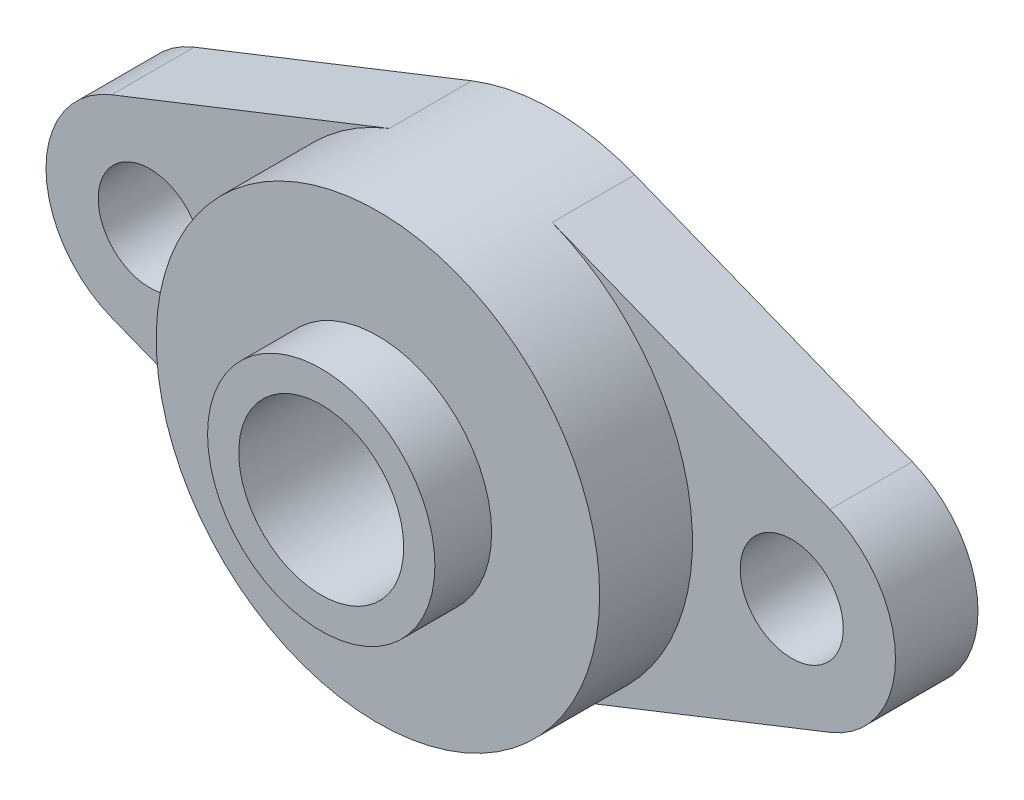
ISO-10303-21;
HEADER;
FILE_DESCRIPTION(('STEP AP214'),'2;1');
FILE_NAME('part.step','',(''),(''),'','','');
FILE_SCHEMA(('AUTOMOTIVE_DESIGN { 1 0 10303 214 1 1 1 1 }'));
ENDSEC;
DATA;
#1=APPLICATION_CONTEXT('core data for automotive mechanical design processes');
#2=APPLICATION_PROTOCOL_DEFINITION('international standard','automotive_design',2000,#1);
#3=PRODUCT_CONTEXT('',#1,'mechanical');
#4=PRODUCT('Part','Part','',(#3));
#5=PRODUCT_RELATED_PRODUCT_CATEGORY('part','',(#4));
#6=PRODUCT_DEFINITION_FORMATION('','',#4);
#7=PRODUCT_DEFINITION_CONTEXT('part definition',#1,'design');
#8=PRODUCT_DEFINITION('design','',#6,#7);
#9=PRODUCT_DEFINITION_SHAPE('','',#8);
#10=(LENGTH_UNIT() NAMED_UNIT(*) SI_UNIT(.MILLI.,.METRE.));
#11=(NAMED_UNIT(*) PLANE_ANGLE_UNIT() SI_UNIT($,.RADIAN.));
#12=(NAMED_UNIT(*) SI_UNIT($,.STERADIAN.) SOLID_ANGLE_UNIT());
#13=UNCERTAINTY_MEASURE_WITH_UNIT(LENGTH_MEASURE(1.E-05),#10,'distance_accuracy_value','');
#14=(GEOMETRIC_REPRESENTATION_CONTEXT(3) GLOBAL_UNCERTAINTY_ASSIGNED_CONTEXT((#13)) GLOBAL_UNIT_ASSIGNED_CONTEXT((#10,
#11,#12)) REPRESENTATION_CONTEXT('',''));
#15=CARTESIAN_POINT('',(0.,0.,0.));
#16=DIRECTION('',(0.,0.,1.));
#17=DIRECTION('',(1.,0.,0.));
#18=AXIS2_PLACEMENT_3D('',#15,#16,#17);
#19=CARTESIAN_POINT('',(-49.4109375,0.,6.35));
#20=DIRECTION('',(0.,0.,1.));
#21=DIRECTION('',(1.,0.,0.));
#22=AXIS2_PLACEMENT_3D('',#19,#20,#21);
#23=PLANE('',#22);
#24=CARTESIAN_POINT('',(0.,0.,6.35));
#25=DIRECTION('',(0.,0.,1.));
#26=DIRECTION('',(1.,0.,0.));
#27=AXIS2_PLACEMENT_3D('',#24,#25,#26);
#28=CIRCLE('',#27,34.13125);
#29=CARTESIAN_POINT('',(-12.5400609044731,31.7441191258256,6.35));
#30=VERTEX_POINT('',#29);
#31=CARTESIAN_POINT('',(-12.5400609044731,-31.7441191258256,6.35));
#32=VERTEX_POINT('',#31);
#33=EDGE_CURVE('E142',#30,#32,#28,.T.);
#34=ORIENTED_EDGE('',*,*,#33,.F.);
#35=DIRECTION('',(0.930060256387492,0.367407021555703,0.));
#36=VECTOR('',#35,1.);
#37=CARTESIAN_POINT('',(-55.2811187513751,14.8598746332539,6.35));
#38=LINE('',#37,#36);
#39=CARTESIAN_POINT('',(-55.2811187513751,14.8598746332539,6.35));
#40=VERTEX_POINT('',#39);
#41=EDGE_CURVE('E232',#40,#30,#38,.T.);
#42=ORIENTED_EDGE('',*,*,#41,.F.);
#43=CARTESIAN_POINT('',(-49.4109375,0.,6.35));
#44=DIRECTION('',(0.,0.,1.));
#45=DIRECTION('',(1.,0.,0.));
#46=AXIS2_PLACEMENT_3D('',#43,#44,#45);
#47=CIRCLE('',#46,15.97732462085);
#48=CARTESIAN_POINT('',(-55.2811187513751,-14.8598746332539,6.35));
#49=VERTEX_POINT('',#48);
#50=EDGE_CURVE('E254',#40,#49,#47,.T.);
#51=ORIENTED_EDGE('',*,*,#50,.T.);
#52=DIRECTION('',(0.930060256387492,-0.367407021555703,0.));
#53=VECTOR('',#52,1.);
#54=CARTESIAN_POINT('',(-55.2811187513751,-14.8598746332539,6.35));
#55=LINE('',#54,#53);
#56=EDGE_CURVE('E195',#49,#32,#55,.T.);
#57=ORIENTED_EDGE('',*,*,#56,.T.);
#58=EDGE_LOOP('',(#34,#42,#51,#57));
#59=FACE_BOUND('',#58,.T.);
#60=CARTESIAN_POINT('',(-49.4109375,0.,6.35));
#61=DIRECTION('',(0.,0.,1.));
#62=DIRECTION('',(1.,0.,0.));
#63=AXIS2_PLACEMENT_3D('',#60,#61,#62);
#64=CIRCLE('',#63,7.9375);
#65=CARTESIAN_POINT('',(-41.4734375,0.,6.35));
#66=VERTEX_POINT('',#65);
#67=EDGE_CURVE('E239',#66,#66,#64,.T.);
#68=ORIENTED_EDGE('',*,*,#67,.F.);
#69=EDGE_LOOP('',(#68));
#70=FACE_BOUND('',#69,.T.);
#71=ADVANCED_FACE('F135',(#59,#70),#23,.T.);
#72=CARTESIAN_POINT('',(12.5400609044731,-31.7441191258256,6.35));
#73=VERTEX_POINT('',#72);
#74=CARTESIAN_POINT('',(12.5400609044731,31.7441191258256,6.35));
#75=VERTEX_POINT('',#74);
#76=EDGE_CURVE('E266',#73,#75,#28,.T.);
#77=ORIENTED_EDGE('',*,*,#76,.F.);
#78=DIRECTION('',(-0.930060256387492,-0.367407021555703,0.));
#79=VECTOR('',#78,1.);
#80=CARTESIAN_POINT('',(55.2811187513751,-14.8598746332539,6.35));
#81=LINE('',#80,#79);
#82=CARTESIAN_POINT('',(55.2811187513751,-14.8598746332539,6.35));
#83=VERTEX_POINT('',#82);
#84=EDGE_CURVE('E230',#83,#73,#81,.T.);
#85=ORIENTED_EDGE('',*,*,#84,.F.);
#86=CARTESIAN_POINT('',(49.4109375,0.,6.35));
#87=DIRECTION('',(0.,0.,-1.));
#88=DIRECTION('',(-1.,0.,0.));
#89=AXIS2_PLACEMENT_3D('',#86,#87,#88);
#90=CIRCLE('',#89,15.97732462085);
#91=CARTESIAN_POINT('',(55.2811187513751,14.8598746332539,6.35));
#92=VERTEX_POINT('',#91);
#93=EDGE_CURVE('E207',#92,#83,#90,.T.);
#94=ORIENTED_EDGE('',*,*,#93,.F.);
#95=DIRECTION('',(0.930060256387492,-0.367407021555703,0.));
#96=VECTOR('',#95,1.);
#97=CARTESIAN_POINT('',(12.5400609044731,31.7441191258256,6.35));
#98=LINE('',#97,#96);
#99=EDGE_CURVE('E221',#75,#92,#98,.T.);
#100=ORIENTED_EDGE('',*,*,#99,.F.);
#101=EDGE_LOOP('',(#77,#85,#94,#100));
#102=FACE_BOUND('',#101,.T.);
#103=CARTESIAN_POINT('',(49.4109375,0.,6.35));
#104=DIRECTION('',(0.,0.,1.));
#105=DIRECTION('',(1.,0.,0.));
#106=AXIS2_PLACEMENT_3D('',#103,#104,#105);
#107=CIRCLE('',#106,7.9375);
#108=CARTESIAN_POINT('',(57.3484375,0.,6.35));
#109=VERTEX_POINT('',#108);
#110=EDGE_CURVE('E272',#109,#109,#107,.T.);
#111=ORIENTED_EDGE('',*,*,#110,.F.);
#112=EDGE_LOOP('',(#111));
#113=FACE_BOUND('',#112,.T.);
#114=ADVANCED_FACE('F225',(#102,#113),#23,.T.);
#115=CARTESIAN_POINT('',(-49.4109375,0.,-6.35));
#116=DIRECTION('',(0.,0.,1.));
#117=DIRECTION('',(1.,0.,0.));
#118=AXIS2_PLACEMENT_3D('',#115,#116,#117);
#119=PLANE('',#118);
#120=CARTESIAN_POINT('',(-49.4109375,0.,-6.35));
#121=DIRECTION('',(0.,0.,1.));
#122=DIRECTION('',(1.,0.,0.));
#123=AXIS2_PLACEMENT_3D('',#120,#121,#122);
#124=CIRCLE('',#123,15.97732462085);
#125=CARTESIAN_POINT('',(-55.2811187513751,14.8598746332539,-6.35));
#126=VERTEX_POINT('',#125);
#127=CARTESIAN_POINT('',(-55.2811187513751,-14.8598746332539,-6.35));
#128=VERTEX_POINT('',#127);
#129=EDGE_CURVE('E237',#126,#128,#124,.T.);
#130=ORIENTED_EDGE('',*,*,#129,.F.);
#131=DIRECTION('',(0.930060256387492,0.367407021555703,0.));
#132=VECTOR('',#131,1.);
#133=CARTESIAN_POINT('',(-55.2811187513751,14.8598746332539,-6.35));
#134=LINE('',#133,#132);
#135=CARTESIAN_POINT('',(-12.5400609044731,31.7441191258256,-6.35));
#136=VERTEX_POINT('',#135);
#137=EDGE_CURVE('E252',#126,#136,#134,.T.);
#138=ORIENTED_EDGE('',*,*,#137,.T.);
#139=CARTESIAN_POINT('',(0.,0.,-6.35));
#140=DIRECTION('',(0.,0.,1.));
#141=DIRECTION('',(1.,0.,0.));
#142=AXIS2_PLACEMENT_3D('',#139,#140,#141);
#143=CIRCLE('',#142,34.13125);
#144=CARTESIAN_POINT('',(12.5400609044731,31.7441191258256,-6.35));
#145=VERTEX_POINT('',#144);
#146=EDGE_CURVE('E246',#145,#136,#143,.T.);
#147=ORIENTED_EDGE('',*,*,#146,.F.);
#148=DIRECTION('',(0.930060256387492,-0.367407021555703,0.));
#149=VECTOR('',#148,1.);
#150=CARTESIAN_POINT('',(12.5400609044731,31.7441191258256,-6.35));
#151=LINE('',#150,#149);
#152=CARTESIAN_POINT('',(55.2811187513751,14.8598746332539,-6.35));
#153=VERTEX_POINT('',#152);
#154=EDGE_CURVE('E248',#145,#153,#151,.T.);
#155=ORIENTED_EDGE('',*,*,#154,.T.);
#156=CARTESIAN_POINT('',(49.4109375,0.,-6.35));
#157=DIRECTION('',(0.,0.,-1.));
#158=DIRECTION('',(-1.,0.,0.));
#159=AXIS2_PLACEMENT_3D('',#156,#157,#158);
#160=CIRCLE('',#159,15.97732462085);
#161=CARTESIAN_POINT('',(55.2811187513751,-14.8598746332539,-6.35));
#162=VERTEX_POINT('',#161);
#163=EDGE_CURVE('E211',#153,#162,#160,.T.);
#164=ORIENTED_EDGE('',*,*,#163,.T.);
#165=DIRECTION('',(-0.930060256387492,-0.367407021555703,0.));
#166=VECTOR('',#165,1.);
#167=CARTESIAN_POINT('',(55.2811187513751,-14.8598746332539,-6.35));
#168=LINE('',#167,#166);
#169=CARTESIAN_POINT('',(12.5400609044731,-31.7441191258256,-6.35));
#170=VERTEX_POINT('',#169);
#171=EDGE_CURVE('E241',#162,#170,#168,.T.);
#172=ORIENTED_EDGE('',*,*,#171,.T.);
#173=CARTESIAN_POINT('',(0.,0.,-6.35));
#174=DIRECTION('',(0.,0.,1.));
#175=DIRECTION('',(1.,0.,0.));
#176=AXIS2_PLACEMENT_3D('',#173,#174,#175);
#177=CIRCLE('',#176,34.13125);
#178=CARTESIAN_POINT('',(-12.5400609044731,-31.7441191258256,-6.35));
#179=VERTEX_POINT('',#178);
#180=EDGE_CURVE('E242',#179,#170,#177,.T.);
#181=ORIENTED_EDGE('',*,*,#180,.F.);
#182=DIRECTION('',(0.930060256387492,-0.367407021555703,0.));
#183=VECTOR('',#182,1.);
#184=CARTESIAN_POINT('',(-55.2811187513751,-14.8598746332539,-6.35));
#185=LINE('',#184,#183);
#186=EDGE_CURVE('E236',#128,#179,#185,.T.);
#187=ORIENTED_EDGE('',*,*,#186,.F.);
#188=EDGE_LOOP('',(#130,#138,#147,#155,#164,#172,#181,#187));
#189=FACE_BOUND('',#188,.T.);
#190=CARTESIAN_POINT('',(-49.4109375,0.,-6.35));
#191=DIRECTION('',(0.,0.,1.));
#192=DIRECTION('',(1.,0.,0.));
#193=AXIS2_PLACEMENT_3D('',#190,#191,#192);
#194=CIRCLE('',#193,7.9375);
#195=CARTESIAN_POINT('',(-41.4734375,0.,-6.35));
#196=VERTEX_POINT('',#195);
#197=EDGE_CURVE('E285',#196,#196,#194,.T.);
#198=ORIENTED_EDGE('',*,*,#197,.T.);
#199=EDGE_LOOP('',(#198));
#200=FACE_BOUND('',#199,.T.);
#201=CARTESIAN_POINT('',(0.,0.,-6.35));
#202=DIRECTION('',(0.,0.,1.));
#203=DIRECTION('',(1.,0.,0.));
#204=AXIS2_PLACEMENT_3D('',#201,#202,#203);
#205=CIRCLE('',#204,12.7);
#206=CARTESIAN_POINT('',(12.7,0.,-6.35));
#207=VERTEX_POINT('',#206);
#208=EDGE_CURVE('E277',#207,#207,#205,.T.);
#209=ORIENTED_EDGE('',*,*,#208,.T.);
#210=EDGE_LOOP('',(#209));
#211=FACE_BOUND('',#210,.T.);
#212=CARTESIAN_POINT('',(49.4109375,0.,-6.35));
#213=DIRECTION('',(0.,0.,1.));
#214=DIRECTION('',(1.,0.,0.));
#215=AXIS2_PLACEMENT_3D('',#212,#213,#214);
#216=CIRCLE('',#215,7.9375);
#217=CARTESIAN_POINT('',(57.3484375,0.,-6.35));
#218=VERTEX_POINT('',#217);
#219=EDGE_CURVE('E280',#218,#218,#216,.T.);
#220=ORIENTED_EDGE('',*,*,#219,.T.);
#221=EDGE_LOOP('',(#220));
#222=FACE_BOUND('',#221,.T.);
#223=ADVANCED_FACE('F295',(#189,#200,#211,#222),#119,.F.);
#224=CARTESIAN_POINT('',(-49.4109375,0.,6.35));
#225=DIRECTION('',(0.,0.,-1.));
#226=DIRECTION('',(-1.,0.,0.));
#227=AXIS2_PLACEMENT_3D('',#224,#225,#226);
#228=CYLINDRICAL_SURFACE('',#227,15.97732462085);
#229=ORIENTED_EDGE('',*,*,#129,.T.);
#230=DIRECTION('',(0.,0.,-1.));
#231=VECTOR('',#230,1.);
#232=CARTESIAN_POINT('',(-55.2811187513751,-14.8598746332539,6.35));
#233=LINE('',#232,#231);
#234=EDGE_CURVE('E137',#49,#128,#233,.T.);
#235=ORIENTED_EDGE('',*,*,#234,.F.);
#236=ORIENTED_EDGE('',*,*,#50,.F.);
#237=DIRECTION('',(0.,0.,-1.));
#238=VECTOR('',#237,1.);
#239=CARTESIAN_POINT('',(-55.2811187513751,14.8598746332539,6.35));
#240=LINE('',#239,#238);
#241=EDGE_CURVE('E151',#40,#126,#240,.T.);
#242=ORIENTED_EDGE('',*,*,#241,.T.);
#243=EDGE_LOOP('',(#229,#235,#236,#242));
#244=FACE_BOUND('',#243,.T.);
#245=ADVANCED_FACE('F131',(#244),#228,.T.);
#246=CARTESIAN_POINT('',(-55.2811187513751,-14.8598746332539,6.35));
#247=DIRECTION('',(0.367407021555703,0.930060256387492,0.));
#248=DIRECTION('',(-0.930060256387492,0.367407021555703,0.));
#249=AXIS2_PLACEMENT_3D('',#246,#247,#248);
#250=PLANE('',#249);
#251=ORIENTED_EDGE('',*,*,#186,.T.);
#252=DIRECTION('',(0.,0.,-1.));
#253=VECTOR('',#252,1.);
#254=CARTESIAN_POINT('',(-12.5400609044731,-31.7441191258256,6.35));
#255=LINE('',#254,#253);
#256=EDGE_CURVE('E261',#32,#179,#255,.T.);
#257=ORIENTED_EDGE('',*,*,#256,.F.);
#258=ORIENTED_EDGE('',*,*,#56,.F.);
#259=ORIENTED_EDGE('',*,*,#234,.T.);
#260=EDGE_LOOP('',(#251,#257,#258,#259));
#261=FACE_BOUND('',#260,.T.);
#262=ADVANCED_FACE('F302',(#261),#250,.F.);
#263=CARTESIAN_POINT('',(55.2811187513751,-14.8598746332539,6.35));
#264=DIRECTION('',(0.367407021555703,-0.930060256387492,0.));
#265=DIRECTION('',(0.930060256387492,0.367407021555703,0.));
#266=AXIS2_PLACEMENT_3D('',#263,#264,#265);
#267=PLANE('',#266);
#268=ORIENTED_EDGE('',*,*,#171,.F.);
#269=DIRECTION('',(0.,0.,-1.));
#270=VECTOR('',#269,1.);
#271=CARTESIAN_POINT('',(55.2811187513751,-14.8598746332539,6.35));
#272=LINE('',#271,#270);
#273=EDGE_CURVE('E216',#83,#162,#272,.T.);
#274=ORIENTED_EDGE('',*,*,#273,.F.);
#275=ORIENTED_EDGE('',*,*,#84,.T.);
#276=DIRECTION('',(0.,0.,-1.));
#277=VECTOR('',#276,1.);
#278=CARTESIAN_POINT('',(12.5400609044731,-31.7441191258256,6.35));
#279=LINE('',#278,#277);
#280=EDGE_CURVE('E257',#73,#170,#279,.T.);
#281=ORIENTED_EDGE('',*,*,#280,.T.);
#282=EDGE_LOOP('',(#268,#274,#275,#281));
#283=FACE_BOUND('',#282,.T.);
#284=ADVANCED_FACE('F286',(#283),#267,.T.);
#285=CARTESIAN_POINT('',(49.4109375,0.,6.35));
#286=DIRECTION('',(0.,0.,-1.));
#287=DIRECTION('',(-1.,0.,0.));
#288=AXIS2_PLACEMENT_3D('',#285,#286,#287);
#289=CYLINDRICAL_SURFACE('',#288,15.97732462085);
#290=ORIENTED_EDGE('',*,*,#163,.F.);
#291=DIRECTION('',(0.,0.,-1.));
#292=VECTOR('',#291,1.);
#293=CARTESIAN_POINT('',(55.2811187513751,14.8598746332539,6.35));
#294=LINE('',#293,#292);
#295=EDGE_CURVE('E206',#92,#153,#294,.T.);
#296=ORIENTED_EDGE('',*,*,#295,.F.);
#297=ORIENTED_EDGE('',*,*,#93,.T.);
#298=ORIENTED_EDGE('',*,*,#273,.T.);
#299=EDGE_LOOP('',(#290,#296,#297,#298));
#300=FACE_BOUND('',#299,.T.);
#301=ADVANCED_FACE('F208',(#300),#289,.T.);
#302=CARTESIAN_POINT('',(12.5400609044731,31.7441191258256,6.35));
#303=DIRECTION('',(0.367407021555703,0.930060256387492,0.));
#304=DIRECTION('',(-0.930060256387492,0.367407021555703,0.));
#305=AXIS2_PLACEMENT_3D('',#302,#303,#304);
#306=PLANE('',#305);
#307=ORIENTED_EDGE('',*,*,#154,.F.);
#308=DIRECTION('',(0.,0.,-1.));
#309=VECTOR('',#308,1.);
#310=CARTESIAN_POINT('',(12.5400609044731,31.7441191258256,6.35));
#311=LINE('',#310,#309);
#312=EDGE_CURVE('E220',#75,#145,#311,.T.);
#313=ORIENTED_EDGE('',*,*,#312,.F.);
#314=ORIENTED_EDGE('',*,*,#99,.T.);
#315=ORIENTED_EDGE('',*,*,#295,.T.);
#316=EDGE_LOOP('',(#307,#313,#314,#315));
#317=FACE_BOUND('',#316,.T.);
#318=ADVANCED_FACE('F226',(#317),#306,.T.);
#319=CARTESIAN_POINT('',(0.,0.,6.35));
#320=DIRECTION('',(0.,0.,-1.));
#321=DIRECTION('',(-1.,0.,0.));
#322=AXIS2_PLACEMENT_3D('',#319,#320,#321);
#323=CYLINDRICAL_SURFACE('',#322,34.13125);
#324=ORIENTED_EDGE('',*,*,#146,.T.);
#325=DIRECTION('',(0.,0.,-1.));
#326=VECTOR('',#325,1.);
#327=CARTESIAN_POINT('',(-12.5400609044731,31.7441191258256,6.35));
#328=LINE('',#327,#326);
#329=EDGE_CURVE('E179',#30,#136,#328,.T.);
#330=ORIENTED_EDGE('',*,*,#329,.F.);
#331=ORIENTED_EDGE('',*,*,#33,.T.);
#332=ORIENTED_EDGE('',*,*,#256,.T.);
#333=ORIENTED_EDGE('',*,*,#180,.T.);
#334=ORIENTED_EDGE('',*,*,#280,.F.);
#335=ORIENTED_EDGE('',*,*,#76,.T.);
#336=ORIENTED_EDGE('',*,*,#312,.T.);
#337=EDGE_LOOP('',(#324,#330,#331,#332,#333,#334,#335,#336));
#338=FACE_BOUND('',#337,.T.);
#339=CARTESIAN_POINT('',(0.,0.,20.6375));
#340=DIRECTION('',(0.,0.,1.));
#341=DIRECTION('',(1.,0.,0.));
#342=AXIS2_PLACEMENT_3D('',#339,#340,#341);
#343=CIRCLE('',#342,34.13125);
#344=CARTESIAN_POINT('',(34.13125,0.,20.6375));
#345=VERTEX_POINT('',#344);
#346=EDGE_CURVE('E275',#345,#345,#343,.T.);
#347=ORIENTED_EDGE('',*,*,#346,.F.);
#348=EDGE_LOOP('',(#347));
#349=FACE_BOUND('',#348,.T.);
#350=ADVANCED_FACE('F293',(#338,#349),#323,.T.);
#351=CARTESIAN_POINT('',(-55.2811187513751,14.8598746332539,6.35));
#352=DIRECTION('',(-0.367407021555703,0.930060256387492,0.));
#353=DIRECTION('',(-0.930060256387492,-0.367407021555703,0.));
#354=AXIS2_PLACEMENT_3D('',#351,#352,#353);
#355=PLANE('',#354);
#356=ORIENTED_EDGE('',*,*,#137,.F.);
#357=ORIENTED_EDGE('',*,*,#241,.F.);
#358=ORIENTED_EDGE('',*,*,#41,.T.);
#359=ORIENTED_EDGE('',*,*,#329,.T.);
#360=EDGE_LOOP('',(#356,#357,#358,#359));
#361=FACE_BOUND('',#360,.T.);
#362=ADVANCED_FACE('F299',(#361),#355,.T.);
#363=CARTESIAN_POINT('',(-49.4109375,0.,6.35));
#364=DIRECTION('',(0.,0.,-1.));
#365=DIRECTION('',(-1.,0.,0.));
#366=AXIS2_PLACEMENT_3D('',#363,#364,#365);
#367=CYLINDRICAL_SURFACE('',#366,7.9375);
#368=ORIENTED_EDGE('',*,*,#67,.T.);
#369=EDGE_LOOP('',(#368));
#370=FACE_BOUND('',#369,.T.);
#371=ORIENTED_EDGE('',*,*,#197,.F.);
#372=EDGE_LOOP('',(#371));
#373=FACE_BOUND('',#372,.T.);
#374=ADVANCED_FACE('F316',(#370,#373),#367,.F.);
#375=CARTESIAN_POINT('',(0.,0.,6.35));
#376=DIRECTION('',(0.,0.,-1.));
#377=DIRECTION('',(-1.,0.,0.));
#378=AXIS2_PLACEMENT_3D('',#375,#376,#377);
#379=CYLINDRICAL_SURFACE('',#378,12.7);
#380=ORIENTED_EDGE('',*,*,#208,.F.);
#381=EDGE_LOOP('',(#380));
#382=FACE_BOUND('',#381,.T.);
#383=CARTESIAN_POINT('',(0.,0.,29.36875));
#384=DIRECTION('',(0.,0.,1.));
#385=DIRECTION('',(1.,0.,0.));
#386=AXIS2_PLACEMENT_3D('',#383,#384,#385);
#387=CIRCLE('',#386,12.7);
#388=CARTESIAN_POINT('',(12.7,0.,29.36875));
#389=VERTEX_POINT('',#388);
#390=EDGE_CURVE('E478',#389,#389,#387,.F.);
#391=ORIENTED_EDGE('',*,*,#390,.F.);
#392=EDGE_LOOP('',(#391));
#393=FACE_BOUND('',#392,.T.);
#394=ADVANCED_FACE('F349',(#382,#393),#379,.F.);
#395=CARTESIAN_POINT('',(49.4109375,0.,6.35));
#396=DIRECTION('',(0.,0.,-1.));
#397=DIRECTION('',(-1.,0.,0.));
#398=AXIS2_PLACEMENT_3D('',#395,#396,#397);
#399=CYLINDRICAL_SURFACE('',#398,7.9375);
#400=ORIENTED_EDGE('',*,*,#110,.T.);
#401=EDGE_LOOP('',(#400));
#402=FACE_BOUND('',#401,.T.);
#403=ORIENTED_EDGE('',*,*,#219,.F.);
#404=EDGE_LOOP('',(#403));
#405=FACE_BOUND('',#404,.T.);
#406=ADVANCED_FACE('F354',(#402,#405),#399,.F.);
#407=CARTESIAN_POINT('',(0.,0.,20.6375));
#408=DIRECTION('',(0.,0.,1.));
#409=DIRECTION('',(1.,0.,0.));
#410=AXIS2_PLACEMENT_3D('',#407,#408,#409);
#411=PLANE('',#410);
#412=CARTESIAN_POINT('',(0.,0.,20.6375));
#413=DIRECTION('',(0.,0.,1.));
#414=DIRECTION('',(1.,0.,0.));
#415=AXIS2_PLACEMENT_3D('',#412,#413,#414);
#416=CIRCLE('',#415,17.5);
#417=CARTESIAN_POINT('',(17.5,0.,20.6375));
#418=VERTEX_POINT('',#417);
#419=EDGE_CURVE('E12',#418,#418,#416,.T.);
#420=ORIENTED_EDGE('',*,*,#419,.F.);
#421=EDGE_LOOP('',(#420));
#422=FACE_BOUND('',#421,.T.);
#423=ORIENTED_EDGE('',*,*,#346,.T.);
#424=EDGE_LOOP('',(#423));
#425=FACE_BOUND('',#424,.T.);
#426=ADVANCED_FACE('F359',(#422,#425),#411,.T.);
#427=CARTESIAN_POINT('',(0.,0.,29.36875));
#428=DIRECTION('',(0.,0.,-1.));
#429=DIRECTION('',(-1.,0.,0.));
#430=AXIS2_PLACEMENT_3D('',#427,#428,#429);
#431=CYLINDRICAL_SURFACE('',#430,17.5);
#432=CARTESIAN_POINT('',(0.,0.,29.36875));
#433=DIRECTION('',(0.,0.,1.));
#434=DIRECTION('',(1.,0.,0.));
#435=AXIS2_PLACEMENT_3D('',#432,#433,#434);
#436=CIRCLE('',#435,17.5);
#437=CARTESIAN_POINT('',(17.5,0.,29.36875));
#438=VERTEX_POINT('',#437);
#439=EDGE_CURVE('E480',#438,#438,#436,.T.);
#440=ORIENTED_EDGE('',*,*,#439,.F.);
#441=EDGE_LOOP('',(#440));
#442=FACE_BOUND('',#441,.T.);
#443=ORIENTED_EDGE('',*,*,#419,.T.);
#444=EDGE_LOOP('',(#443));
#445=FACE_BOUND('',#444,.T.);
#446=ADVANCED_FACE('F361',(#442,#445),#431,.T.);
#447=CARTESIAN_POINT('',(0.,0.,29.36875));
#448=DIRECTION('',(0.,0.,1.));
#449=DIRECTION('',(1.,0.,0.));
#450=AXIS2_PLACEMENT_3D('',#447,#448,#449);
#451=PLANE('',#450);
#452=ORIENTED_EDGE('',*,*,#390,.T.);
#453=EDGE_LOOP('',(#452));
#454=FACE_BOUND('',#453,.T.);
#455=ORIENTED_EDGE('',*,*,#439,.T.);
#456=EDGE_LOOP('',(#455));
#457=FACE_BOUND('',#456,.T.);
#458=ADVANCED_FACE('F375',(#454,#457),#451,.T.);
#459=CLOSED_SHELL('',(#71,#114,#223,#245,#262,#284,#301,#318,#350,#362,#374,#394,#406,#426,#446,#458));
#460=MANIFOLD_SOLID_BREP('B2',#459);
#461=ADVANCED_BREP_SHAPE_REPRESENTATION('',(#18,#460),#14);
#462=SHAPE_DEFINITION_REPRESENTATION(#9,#461);
ENDSEC;
END-ISO-10303-21;
